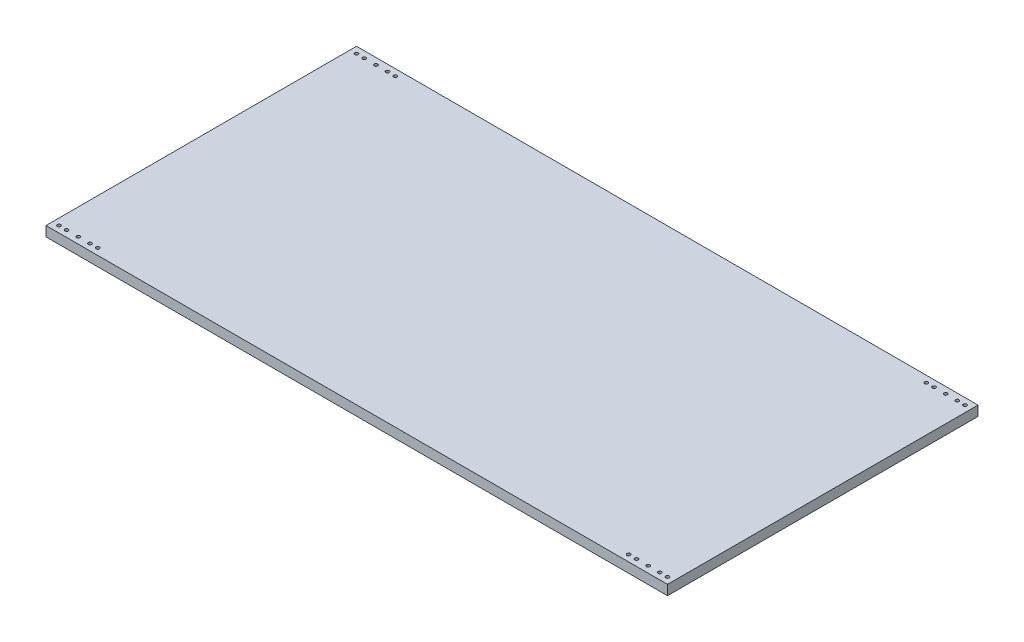
ISO-10303-21;
HEADER;
FILE_DESCRIPTION(('STEP AP214'),'2;1');
FILE_NAME('part.step','',(''),(''),'','','');
FILE_SCHEMA(('AUTOMOTIVE_DESIGN { 1 0 10303 214 1 1 1 1 }'));
ENDSEC;
DATA;
#1=APPLICATION_CONTEXT('core data for automotive mechanical design processes');
#2=APPLICATION_PROTOCOL_DEFINITION('international standard','automotive_design',2000,#1);
#3=PRODUCT_CONTEXT('',#1,'mechanical');
#4=PRODUCT('Part','Part','',(#3));
#5=PRODUCT_RELATED_PRODUCT_CATEGORY('part','',(#4));
#6=PRODUCT_DEFINITION_FORMATION('','',#4);
#7=PRODUCT_DEFINITION_CONTEXT('part definition',#1,'design');
#8=PRODUCT_DEFINITION('design','',#6,#7);
#9=PRODUCT_DEFINITION_SHAPE('','',#8);
#10=(LENGTH_UNIT() NAMED_UNIT(*) SI_UNIT(.MILLI.,.METRE.));
#11=(NAMED_UNIT(*) PLANE_ANGLE_UNIT() SI_UNIT($,.RADIAN.));
#12=(NAMED_UNIT(*) SI_UNIT($,.STERADIAN.) SOLID_ANGLE_UNIT());
#13=UNCERTAINTY_MEASURE_WITH_UNIT(LENGTH_MEASURE(1.E-05),#10,'distance_accuracy_value','');
#14=(GEOMETRIC_REPRESENTATION_CONTEXT(3) GLOBAL_UNCERTAINTY_ASSIGNED_CONTEXT((#13)) GLOBAL_UNIT_ASSIGNED_CONTEXT((#10,
#11,#12)) REPRESENTATION_CONTEXT('',''));
#15=CARTESIAN_POINT('',(0.,0.,0.));
#16=DIRECTION('',(0.,0.,1.));
#17=DIRECTION('',(1.,0.,0.));
#18=AXIS2_PLACEMENT_3D('',#15,#16,#17);
#19=CARTESIAN_POINT('',(0.,0.,0.));
#20=DIRECTION('',(0.,1.,0.));
#21=DIRECTION('',(0.,0.,1.));
#22=AXIS2_PLACEMENT_3D('',#19,#20,#21);
#23=PLANE('',#22);
#24=CARTESIAN_POINT('',(-528.,0.,287.5));
#25=DIRECTION('',(0.,-1.,0.));
#26=DIRECTION('',(0.,0.,-1.));
#27=AXIS2_PLACEMENT_3D('',#24,#25,#26);
#28=CIRCLE('',#27,3.29999999999997);
#29=CARTESIAN_POINT('',(-528.,0.,284.2));
#30=VERTEX_POINT('',#29);
#31=EDGE_CURVE('E221',#30,#30,#28,.T.);
#32=ORIENTED_EDGE('',*,*,#31,.F.);
#33=EDGE_LOOP('',(#32));
#34=FACE_BOUND('',#33,.T.);
#35=CARTESIAN_POINT('',(-513.,0.,287.5));
#36=DIRECTION('',(0.,-1.,0.));
#37=DIRECTION('',(0.,0.,-1.));
#38=AXIS2_PLACEMENT_3D('',#35,#36,#37);
#39=CIRCLE('',#38,3.29999999999997);
#40=CARTESIAN_POINT('',(-513.,0.,284.2));
#41=VERTEX_POINT('',#40);
#42=EDGE_CURVE('E215',#41,#41,#39,.T.);
#43=ORIENTED_EDGE('',*,*,#42,.F.);
#44=EDGE_LOOP('',(#43));
#45=FACE_BOUND('',#44,.T.);
#46=CARTESIAN_POINT('',(-588.,0.,-287.5));
#47=DIRECTION('',(0.,-1.,0.));
#48=DIRECTION('',(0.,0.,-1.));
#49=AXIS2_PLACEMENT_3D('',#46,#47,#48);
#50=CIRCLE('',#49,3.29999999999997);
#51=CARTESIAN_POINT('',(-588.,0.,-290.8));
#52=VERTEX_POINT('',#51);
#53=EDGE_CURVE('E209',#52,#52,#50,.T.);
#54=ORIENTED_EDGE('',*,*,#53,.F.);
#55=EDGE_LOOP('',(#54));
#56=FACE_BOUND('',#55,.T.);
#57=CARTESIAN_POINT('',(-550.5,0.,-287.5));
#58=DIRECTION('',(0.,-1.,0.));
#59=DIRECTION('',(0.,0.,-1.));
#60=AXIS2_PLACEMENT_3D('',#57,#58,#59);
#61=CIRCLE('',#60,3.29999999999997);
#62=CARTESIAN_POINT('',(-550.5,0.,-290.8));
#63=VERTEX_POINT('',#62);
#64=EDGE_CURVE('E197',#63,#63,#61,.T.);
#65=ORIENTED_EDGE('',*,*,#64,.F.);
#66=EDGE_LOOP('',(#65));
#67=FACE_BOUND('',#66,.T.);
#68=CARTESIAN_POINT('',(-513.,0.,-287.5));
#69=DIRECTION('',(0.,-1.,0.));
#70=DIRECTION('',(0.,0.,-1.));
#71=AXIS2_PLACEMENT_3D('',#68,#69,#70);
#72=CIRCLE('',#71,3.29999999999997);
#73=CARTESIAN_POINT('',(-513.,0.,-290.8));
#74=VERTEX_POINT('',#73);
#75=EDGE_CURVE('E185',#74,#74,#72,.T.);
#76=ORIENTED_EDGE('',*,*,#75,.F.);
#77=EDGE_LOOP('',(#76));
#78=FACE_BOUND('',#77,.T.);
#79=CARTESIAN_POINT('',(513.,0.,-287.5));
#80=DIRECTION('',(0.,-1.,0.));
#81=DIRECTION('',(0.,0.,-1.));
#82=AXIS2_PLACEMENT_3D('',#79,#80,#81);
#83=CIRCLE('',#82,3.29999999999997);
#84=CARTESIAN_POINT('',(513.,0.,-290.8));
#85=VERTEX_POINT('',#84);
#86=EDGE_CURVE('E179',#85,#85,#83,.T.);
#87=ORIENTED_EDGE('',*,*,#86,.F.);
#88=EDGE_LOOP('',(#87));
#89=FACE_BOUND('',#88,.T.);
#90=CARTESIAN_POINT('',(528.,0.,-287.5));
#91=DIRECTION('',(0.,-1.,0.));
#92=DIRECTION('',(0.,0.,-1.));
#93=AXIS2_PLACEMENT_3D('',#90,#91,#92);
#94=CIRCLE('',#93,3.29999999999997);
#95=CARTESIAN_POINT('',(528.,0.,-290.8));
#96=VERTEX_POINT('',#95);
#97=EDGE_CURVE('E173',#96,#96,#94,.T.);
#98=ORIENTED_EDGE('',*,*,#97,.F.);
#99=EDGE_LOOP('',(#98));
#100=FACE_BOUND('',#99,.T.);
#101=CARTESIAN_POINT('',(573.,0.,-287.5));
#102=DIRECTION('',(0.,-1.,0.));
#103=DIRECTION('',(0.,0.,-1.));
#104=AXIS2_PLACEMENT_3D('',#101,#102,#103);
#105=CIRCLE('',#104,3.29999999999997);
#106=CARTESIAN_POINT('',(573.,0.,-290.8));
#107=VERTEX_POINT('',#106);
#108=EDGE_CURVE('E161',#107,#107,#105,.T.);
#109=ORIENTED_EDGE('',*,*,#108,.F.);
#110=EDGE_LOOP('',(#109));
#111=FACE_BOUND('',#110,.T.);
#112=CARTESIAN_POINT('',(513.,0.,287.5));
#113=DIRECTION('',(0.,-1.,0.));
#114=DIRECTION('',(0.,0.,-1.));
#115=AXIS2_PLACEMENT_3D('',#112,#113,#114);
#116=CIRCLE('',#115,3.29999999999997);
#117=CARTESIAN_POINT('',(513.,0.,284.2));
#118=VERTEX_POINT('',#117);
#119=EDGE_CURVE('E149',#118,#118,#116,.T.);
#120=ORIENTED_EDGE('',*,*,#119,.F.);
#121=EDGE_LOOP('',(#120));
#122=FACE_BOUND('',#121,.T.);
#123=CARTESIAN_POINT('',(528.,0.,287.5));
#124=DIRECTION('',(0.,-1.,0.));
#125=DIRECTION('',(0.,0.,-1.));
#126=AXIS2_PLACEMENT_3D('',#123,#124,#125);
#127=CIRCLE('',#126,3.29999999999997);
#128=CARTESIAN_POINT('',(528.,0.,284.2));
#129=VERTEX_POINT('',#128);
#130=EDGE_CURVE('E143',#129,#129,#127,.T.);
#131=ORIENTED_EDGE('',*,*,#130,.F.);
#132=EDGE_LOOP('',(#131));
#133=FACE_BOUND('',#132,.T.);
#134=CARTESIAN_POINT('',(588.,0.,287.5));
#135=DIRECTION('',(0.,-1.,0.));
#136=DIRECTION('',(0.,0.,-1.));
#137=AXIS2_PLACEMENT_3D('',#134,#135,#136);
#138=CIRCLE('',#137,3.29999999999997);
#139=CARTESIAN_POINT('',(588.,0.,284.2));
#140=VERTEX_POINT('',#139);
#141=EDGE_CURVE('E125',#140,#140,#138,.T.);
#142=ORIENTED_EDGE('',*,*,#141,.F.);
#143=EDGE_LOOP('',(#142));
#144=FACE_BOUND('',#143,.T.);
#145=DIRECTION('',(0.,0.,-1.));
#146=VECTOR('',#145,1.);
#147=CARTESIAN_POINT('',(600.5,0.,-300.));
#148=LINE('',#147,#146);
#149=CARTESIAN_POINT('',(600.5,0.,300.));
#150=VERTEX_POINT('',#149);
#151=CARTESIAN_POINT('',(600.5,0.,-300.));
#152=VERTEX_POINT('',#151);
#153=EDGE_CURVE('E109',#150,#152,#148,.T.);
#154=ORIENTED_EDGE('',*,*,#153,.F.);
#155=DIRECTION('',(1.,0.,0.));
#156=VECTOR('',#155,1.);
#157=CARTESIAN_POINT('',(-600.5,0.,300.));
#158=LINE('',#157,#156);
#159=CARTESIAN_POINT('',(-600.5,0.,300.));
#160=VERTEX_POINT('',#159);
#161=EDGE_CURVE('E84',#160,#150,#158,.T.);
#162=ORIENTED_EDGE('',*,*,#161,.F.);
#163=DIRECTION('',(0.,0.,1.));
#164=VECTOR('',#163,1.);
#165=CARTESIAN_POINT('',(-600.5,0.,-300.));
#166=LINE('',#165,#164);
#167=CARTESIAN_POINT('',(-600.5,0.,-300.));
#168=VERTEX_POINT('',#167);
#169=EDGE_CURVE('E78',#168,#160,#166,.T.);
#170=ORIENTED_EDGE('',*,*,#169,.F.);
#171=DIRECTION('',(-1.,0.,0.));
#172=VECTOR('',#171,1.);
#173=CARTESIAN_POINT('',(-600.5,0.,-300.));
#174=LINE('',#173,#172);
#175=EDGE_CURVE('E101',#152,#168,#174,.T.);
#176=ORIENTED_EDGE('',*,*,#175,.F.);
#177=EDGE_LOOP('',(#154,#162,#170,#176));
#178=FACE_BOUND('',#177,.T.);
#179=CARTESIAN_POINT('',(573.,0.,287.5));
#180=DIRECTION('',(0.,-1.,0.));
#181=DIRECTION('',(0.,0.,-1.));
#182=AXIS2_PLACEMENT_3D('',#179,#180,#181);
#183=CIRCLE('',#182,3.29999999999997);
#184=CARTESIAN_POINT('',(573.,0.,284.2));
#185=VERTEX_POINT('',#184);
#186=EDGE_CURVE('E131',#185,#185,#183,.T.);
#187=ORIENTED_EDGE('',*,*,#186,.F.);
#188=EDGE_LOOP('',(#187));
#189=FACE_BOUND('',#188,.T.);
#190=CARTESIAN_POINT('',(550.5,0.,287.5));
#191=DIRECTION('',(0.,-1.,0.));
#192=DIRECTION('',(0.,0.,-1.));
#193=AXIS2_PLACEMENT_3D('',#190,#191,#192);
#194=CIRCLE('',#193,3.29999999999997);
#195=CARTESIAN_POINT('',(550.5,0.,284.2));
#196=VERTEX_POINT('',#195);
#197=EDGE_CURVE('E137',#196,#196,#194,.T.);
#198=ORIENTED_EDGE('',*,*,#197,.F.);
#199=EDGE_LOOP('',(#198));
#200=FACE_BOUND('',#199,.T.);
#201=CARTESIAN_POINT('',(588.,0.,-287.5));
#202=DIRECTION('',(0.,-1.,0.));
#203=DIRECTION('',(0.,0.,-1.));
#204=AXIS2_PLACEMENT_3D('',#201,#202,#203);
#205=CIRCLE('',#204,3.29999999999997);
#206=CARTESIAN_POINT('',(588.,0.,-290.8));
#207=VERTEX_POINT('',#206);
#208=EDGE_CURVE('E155',#207,#207,#205,.T.);
#209=ORIENTED_EDGE('',*,*,#208,.F.);
#210=EDGE_LOOP('',(#209));
#211=FACE_BOUND('',#210,.T.);
#212=CARTESIAN_POINT('',(550.5,0.,-287.5));
#213=DIRECTION('',(0.,-1.,0.));
#214=DIRECTION('',(0.,0.,-1.));
#215=AXIS2_PLACEMENT_3D('',#212,#213,#214);
#216=CIRCLE('',#215,3.29999999999997);
#217=CARTESIAN_POINT('',(550.5,0.,-290.8));
#218=VERTEX_POINT('',#217);
#219=EDGE_CURVE('E167',#218,#218,#216,.T.);
#220=ORIENTED_EDGE('',*,*,#219,.F.);
#221=EDGE_LOOP('',(#220));
#222=FACE_BOUND('',#221,.T.);
#223=CARTESIAN_POINT('',(-528.,0.,-287.5));
#224=DIRECTION('',(0.,-1.,0.));
#225=DIRECTION('',(0.,0.,-1.));
#226=AXIS2_PLACEMENT_3D('',#223,#224,#225);
#227=CIRCLE('',#226,3.29999999999997);
#228=CARTESIAN_POINT('',(-528.,0.,-290.8));
#229=VERTEX_POINT('',#228);
#230=EDGE_CURVE('E191',#229,#229,#227,.T.);
#231=ORIENTED_EDGE('',*,*,#230,.F.);
#232=EDGE_LOOP('',(#231));
#233=FACE_BOUND('',#232,.T.);
#234=CARTESIAN_POINT('',(-573.,0.,-287.5));
#235=DIRECTION('',(0.,-1.,0.));
#236=DIRECTION('',(0.,0.,-1.));
#237=AXIS2_PLACEMENT_3D('',#234,#235,#236);
#238=CIRCLE('',#237,3.29999999999997);
#239=CARTESIAN_POINT('',(-573.,0.,-290.8));
#240=VERTEX_POINT('',#239);
#241=EDGE_CURVE('E203',#240,#240,#238,.T.);
#242=ORIENTED_EDGE('',*,*,#241,.F.);
#243=EDGE_LOOP('',(#242));
#244=FACE_BOUND('',#243,.T.);
#245=CARTESIAN_POINT('',(-550.5,0.,287.5));
#246=DIRECTION('',(0.,-1.,0.));
#247=DIRECTION('',(0.,0.,-1.));
#248=AXIS2_PLACEMENT_3D('',#245,#246,#247);
#249=CIRCLE('',#248,3.29999999999997);
#250=CARTESIAN_POINT('',(-550.5,0.,284.2));
#251=VERTEX_POINT('',#250);
#252=EDGE_CURVE('E227',#251,#251,#249,.T.);
#253=ORIENTED_EDGE('',*,*,#252,.F.);
#254=EDGE_LOOP('',(#253));
#255=FACE_BOUND('',#254,.T.);
#256=CARTESIAN_POINT('',(-573.,0.,287.5));
#257=DIRECTION('',(0.,-1.,0.));
#258=DIRECTION('',(0.,0.,-1.));
#259=AXIS2_PLACEMENT_3D('',#256,#257,#258);
#260=CIRCLE('',#259,3.29999999999997);
#261=CARTESIAN_POINT('',(-573.,0.,284.2));
#262=VERTEX_POINT('',#261);
#263=EDGE_CURVE('E233',#262,#262,#260,.T.);
#264=ORIENTED_EDGE('',*,*,#263,.F.);
#265=EDGE_LOOP('',(#264));
#266=FACE_BOUND('',#265,.T.);
#267=CARTESIAN_POINT('',(-588.,0.,287.5));
#268=DIRECTION('',(0.,-1.,0.));
#269=DIRECTION('',(0.,0.,-1.));
#270=AXIS2_PLACEMENT_3D('',#267,#268,#269);
#271=CIRCLE('',#270,3.29999999999997);
#272=CARTESIAN_POINT('',(-588.,0.,284.2));
#273=VERTEX_POINT('',#272);
#274=EDGE_CURVE('E239',#273,#273,#271,.T.);
#275=ORIENTED_EDGE('',*,*,#274,.F.);
#276=EDGE_LOOP('',(#275));
#277=FACE_BOUND('',#276,.T.);
#278=ADVANCED_FACE('F44',(#34,#45,#56,#67,#78,#89,#100,#111,#122,#133,#144,#178,#189,#200,#211,
#222,#233,#244,#255,#266,#277),#23,.F.);
#279=CARTESIAN_POINT('',(0.,19.05,0.));
#280=DIRECTION('',(0.,1.,0.));
#281=DIRECTION('',(0.,0.,1.));
#282=AXIS2_PLACEMENT_3D('',#279,#280,#281);
#283=PLANE('',#282);
#284=CARTESIAN_POINT('',(-588.,19.05,287.5));
#285=DIRECTION('',(0.,-1.,0.));
#286=DIRECTION('',(0.,0.,-1.));
#287=AXIS2_PLACEMENT_3D('',#284,#285,#286);
#288=CIRCLE('',#287,3.29999999999997);
#289=CARTESIAN_POINT('',(-588.,19.05,284.2));
#290=VERTEX_POINT('',#289);
#291=EDGE_CURVE('E236',#290,#290,#288,.T.);
#292=ORIENTED_EDGE('',*,*,#291,.T.);
#293=EDGE_LOOP('',(#292));
#294=FACE_BOUND('',#293,.T.);
#295=CARTESIAN_POINT('',(-573.,19.05,287.5));
#296=DIRECTION('',(0.,-1.,0.));
#297=DIRECTION('',(0.,0.,-1.));
#298=AXIS2_PLACEMENT_3D('',#295,#296,#297);
#299=CIRCLE('',#298,3.29999999999997);
#300=CARTESIAN_POINT('',(-573.,19.05,284.2));
#301=VERTEX_POINT('',#300);
#302=EDGE_CURVE('E230',#301,#301,#299,.T.);
#303=ORIENTED_EDGE('',*,*,#302,.T.);
#304=EDGE_LOOP('',(#303));
#305=FACE_BOUND('',#304,.T.);
#306=CARTESIAN_POINT('',(-550.5,19.05,287.5));
#307=DIRECTION('',(0.,-1.,0.));
#308=DIRECTION('',(0.,0.,-1.));
#309=AXIS2_PLACEMENT_3D('',#306,#307,#308);
#310=CIRCLE('',#309,3.29999999999997);
#311=CARTESIAN_POINT('',(-550.5,19.05,284.2));
#312=VERTEX_POINT('',#311);
#313=EDGE_CURVE('E224',#312,#312,#310,.T.);
#314=ORIENTED_EDGE('',*,*,#313,.T.);
#315=EDGE_LOOP('',(#314));
#316=FACE_BOUND('',#315,.T.);
#317=CARTESIAN_POINT('',(-528.,19.05,287.5));
#318=DIRECTION('',(0.,-1.,0.));
#319=DIRECTION('',(0.,0.,-1.));
#320=AXIS2_PLACEMENT_3D('',#317,#318,#319);
#321=CIRCLE('',#320,3.29999999999997);
#322=CARTESIAN_POINT('',(-528.,19.05,284.2));
#323=VERTEX_POINT('',#322);
#324=EDGE_CURVE('E218',#323,#323,#321,.T.);
#325=ORIENTED_EDGE('',*,*,#324,.T.);
#326=EDGE_LOOP('',(#325));
#327=FACE_BOUND('',#326,.T.);
#328=CARTESIAN_POINT('',(-513.,19.05,287.5));
#329=DIRECTION('',(0.,-1.,0.));
#330=DIRECTION('',(0.,0.,-1.));
#331=AXIS2_PLACEMENT_3D('',#328,#329,#330);
#332=CIRCLE('',#331,3.29999999999997);
#333=CARTESIAN_POINT('',(-513.,19.05,284.2));
#334=VERTEX_POINT('',#333);
#335=EDGE_CURVE('E212',#334,#334,#332,.T.);
#336=ORIENTED_EDGE('',*,*,#335,.T.);
#337=EDGE_LOOP('',(#336));
#338=FACE_BOUND('',#337,.T.);
#339=CARTESIAN_POINT('',(-588.,19.05,-287.5));
#340=DIRECTION('',(0.,-1.,0.));
#341=DIRECTION('',(0.,0.,-1.));
#342=AXIS2_PLACEMENT_3D('',#339,#340,#341);
#343=CIRCLE('',#342,3.29999999999997);
#344=CARTESIAN_POINT('',(-588.,19.05,-290.8));
#345=VERTEX_POINT('',#344);
#346=EDGE_CURVE('E206',#345,#345,#343,.T.);
#347=ORIENTED_EDGE('',*,*,#346,.T.);
#348=EDGE_LOOP('',(#347));
#349=FACE_BOUND('',#348,.T.);
#350=CARTESIAN_POINT('',(-528.,19.05,-287.5));
#351=DIRECTION('',(0.,-1.,0.));
#352=DIRECTION('',(0.,0.,-1.));
#353=AXIS2_PLACEMENT_3D('',#350,#351,#352);
#354=CIRCLE('',#353,3.29999999999997);
#355=CARTESIAN_POINT('',(-528.,19.05,-290.8));
#356=VERTEX_POINT('',#355);
#357=EDGE_CURVE('E188',#356,#356,#354,.T.);
#358=ORIENTED_EDGE('',*,*,#357,.T.);
#359=EDGE_LOOP('',(#358));
#360=FACE_BOUND('',#359,.T.);
#361=CARTESIAN_POINT('',(-513.,19.05,-287.5));
#362=DIRECTION('',(0.,-1.,0.));
#363=DIRECTION('',(0.,0.,-1.));
#364=AXIS2_PLACEMENT_3D('',#361,#362,#363);
#365=CIRCLE('',#364,3.29999999999997);
#366=CARTESIAN_POINT('',(-513.,19.05,-290.8));
#367=VERTEX_POINT('',#366);
#368=EDGE_CURVE('E182',#367,#367,#365,.T.);
#369=ORIENTED_EDGE('',*,*,#368,.T.);
#370=EDGE_LOOP('',(#369));
#371=FACE_BOUND('',#370,.T.);
#372=CARTESIAN_POINT('',(513.,19.05,-287.5));
#373=DIRECTION('',(0.,-1.,0.));
#374=DIRECTION('',(0.,0.,-1.));
#375=AXIS2_PLACEMENT_3D('',#372,#373,#374);
#376=CIRCLE('',#375,3.29999999999997);
#377=CARTESIAN_POINT('',(513.,19.05,-290.8));
#378=VERTEX_POINT('',#377);
#379=EDGE_CURVE('E176',#378,#378,#376,.T.);
#380=ORIENTED_EDGE('',*,*,#379,.T.);
#381=EDGE_LOOP('',(#380));
#382=FACE_BOUND('',#381,.T.);
#383=CARTESIAN_POINT('',(528.,19.05,-287.5));
#384=DIRECTION('',(0.,-1.,0.));
#385=DIRECTION('',(0.,0.,-1.));
#386=AXIS2_PLACEMENT_3D('',#383,#384,#385);
#387=CIRCLE('',#386,3.29999999999997);
#388=CARTESIAN_POINT('',(528.,19.05,-290.8));
#389=VERTEX_POINT('',#388);
#390=EDGE_CURVE('E170',#389,#389,#387,.T.);
#391=ORIENTED_EDGE('',*,*,#390,.T.);
#392=EDGE_LOOP('',(#391));
#393=FACE_BOUND('',#392,.T.);
#394=CARTESIAN_POINT('',(588.,19.05,-287.5));
#395=DIRECTION('',(0.,-1.,0.));
#396=DIRECTION('',(0.,0.,-1.));
#397=AXIS2_PLACEMENT_3D('',#394,#395,#396);
#398=CIRCLE('',#397,3.29999999999997);
#399=CARTESIAN_POINT('',(588.,19.05,-290.8));
#400=VERTEX_POINT('',#399);
#401=EDGE_CURVE('E152',#400,#400,#398,.T.);
#402=ORIENTED_EDGE('',*,*,#401,.T.);
#403=EDGE_LOOP('',(#402));
#404=FACE_BOUND('',#403,.T.);
#405=CARTESIAN_POINT('',(513.,19.05,287.5));
#406=DIRECTION('',(0.,-1.,0.));
#407=DIRECTION('',(0.,0.,-1.));
#408=AXIS2_PLACEMENT_3D('',#405,#406,#407);
#409=CIRCLE('',#408,3.29999999999997);
#410=CARTESIAN_POINT('',(513.,19.05,284.2));
#411=VERTEX_POINT('',#410);
#412=EDGE_CURVE('E146',#411,#411,#409,.T.);
#413=ORIENTED_EDGE('',*,*,#412,.T.);
#414=EDGE_LOOP('',(#413));
#415=FACE_BOUND('',#414,.T.);
#416=CARTESIAN_POINT('',(528.,19.05,287.5));
#417=DIRECTION('',(0.,-1.,0.));
#418=DIRECTION('',(0.,0.,-1.));
#419=AXIS2_PLACEMENT_3D('',#416,#417,#418);
#420=CIRCLE('',#419,3.29999999999997);
#421=CARTESIAN_POINT('',(528.,19.05,284.2));
#422=VERTEX_POINT('',#421);
#423=EDGE_CURVE('E140',#422,#422,#420,.T.);
#424=ORIENTED_EDGE('',*,*,#423,.T.);
#425=EDGE_LOOP('',(#424));
#426=FACE_BOUND('',#425,.T.);
#427=CARTESIAN_POINT('',(550.5,19.05,287.5));
#428=DIRECTION('',(0.,-1.,0.));
#429=DIRECTION('',(0.,0.,-1.));
#430=AXIS2_PLACEMENT_3D('',#427,#428,#429);
#431=CIRCLE('',#430,3.29999999999997);
#432=CARTESIAN_POINT('',(550.5,19.05,284.2));
#433=VERTEX_POINT('',#432);
#434=EDGE_CURVE('E134',#433,#433,#431,.T.);
#435=ORIENTED_EDGE('',*,*,#434,.T.);
#436=EDGE_LOOP('',(#435));
#437=FACE_BOUND('',#436,.T.);
#438=DIRECTION('',(0.,0.,-1.));
#439=VECTOR('',#438,1.);
#440=CARTESIAN_POINT('',(600.5,19.05,-300.));
#441=LINE('',#440,#439);
#442=CARTESIAN_POINT('',(600.5,19.05,300.));
#443=VERTEX_POINT('',#442);
#444=CARTESIAN_POINT('',(600.5,19.05,-300.));
#445=VERTEX_POINT('',#444);
#446=EDGE_CURVE('E97',#443,#445,#441,.T.);
#447=ORIENTED_EDGE('',*,*,#446,.T.);
#448=DIRECTION('',(-1.,0.,0.));
#449=VECTOR('',#448,1.);
#450=CARTESIAN_POINT('',(-600.5,19.05,-300.));
#451=LINE('',#450,#449);
#452=CARTESIAN_POINT('',(-600.5,19.05,-300.));
#453=VERTEX_POINT('',#452);
#454=EDGE_CURVE('E91',#445,#453,#451,.T.);
#455=ORIENTED_EDGE('',*,*,#454,.T.);
#456=DIRECTION('',(0.,0.,1.));
#457=VECTOR('',#456,1.);
#458=CARTESIAN_POINT('',(-600.5,19.05,-300.));
#459=LINE('',#458,#457);
#460=CARTESIAN_POINT('',(-600.5,19.05,300.));
#461=VERTEX_POINT('',#460);
#462=EDGE_CURVE('E95',#453,#461,#459,.T.);
#463=ORIENTED_EDGE('',*,*,#462,.T.);
#464=DIRECTION('',(1.,0.,0.));
#465=VECTOR('',#464,1.);
#466=CARTESIAN_POINT('',(-600.5,19.05,300.));
#467=LINE('',#466,#465);
#468=EDGE_CURVE('E61',#461,#443,#467,.T.);
#469=ORIENTED_EDGE('',*,*,#468,.T.);
#470=EDGE_LOOP('',(#447,#455,#463,#469));
#471=FACE_BOUND('',#470,.T.);
#472=CARTESIAN_POINT('',(588.,19.05,287.5));
#473=DIRECTION('',(0.,-1.,0.));
#474=DIRECTION('',(0.,0.,-1.));
#475=AXIS2_PLACEMENT_3D('',#472,#473,#474);
#476=CIRCLE('',#475,3.29999999999997);
#477=CARTESIAN_POINT('',(588.,19.05,284.2));
#478=VERTEX_POINT('',#477);
#479=EDGE_CURVE('E112',#478,#478,#476,.T.);
#480=ORIENTED_EDGE('',*,*,#479,.T.);
#481=EDGE_LOOP('',(#480));
#482=FACE_BOUND('',#481,.T.);
#483=CARTESIAN_POINT('',(573.,19.05,287.5));
#484=DIRECTION('',(0.,-1.,0.));
#485=DIRECTION('',(0.,0.,-1.));
#486=AXIS2_PLACEMENT_3D('',#483,#484,#485);
#487=CIRCLE('',#486,3.29999999999997);
#488=CARTESIAN_POINT('',(573.,19.05,284.2));
#489=VERTEX_POINT('',#488);
#490=EDGE_CURVE('E128',#489,#489,#487,.T.);
#491=ORIENTED_EDGE('',*,*,#490,.T.);
#492=EDGE_LOOP('',(#491));
#493=FACE_BOUND('',#492,.T.);
#494=CARTESIAN_POINT('',(573.,19.05,-287.5));
#495=DIRECTION('',(0.,-1.,0.));
#496=DIRECTION('',(0.,0.,-1.));
#497=AXIS2_PLACEMENT_3D('',#494,#495,#496);
#498=CIRCLE('',#497,3.29999999999997);
#499=CARTESIAN_POINT('',(573.,19.05,-290.8));
#500=VERTEX_POINT('',#499);
#501=EDGE_CURVE('E158',#500,#500,#498,.T.);
#502=ORIENTED_EDGE('',*,*,#501,.T.);
#503=EDGE_LOOP('',(#502));
#504=FACE_BOUND('',#503,.T.);
#505=CARTESIAN_POINT('',(550.5,19.05,-287.5));
#506=DIRECTION('',(0.,-1.,0.));
#507=DIRECTION('',(0.,0.,-1.));
#508=AXIS2_PLACEMENT_3D('',#505,#506,#507);
#509=CIRCLE('',#508,3.29999999999997);
#510=CARTESIAN_POINT('',(550.5,19.05,-290.8));
#511=VERTEX_POINT('',#510);
#512=EDGE_CURVE('E164',#511,#511,#509,.T.);
#513=ORIENTED_EDGE('',*,*,#512,.T.);
#514=EDGE_LOOP('',(#513));
#515=FACE_BOUND('',#514,.T.);
#516=CARTESIAN_POINT('',(-550.5,19.05,-287.5));
#517=DIRECTION('',(0.,-1.,0.));
#518=DIRECTION('',(0.,0.,-1.));
#519=AXIS2_PLACEMENT_3D('',#516,#517,#518);
#520=CIRCLE('',#519,3.29999999999997);
#521=CARTESIAN_POINT('',(-550.5,19.05,-290.8));
#522=VERTEX_POINT('',#521);
#523=EDGE_CURVE('E194',#522,#522,#520,.T.);
#524=ORIENTED_EDGE('',*,*,#523,.T.);
#525=EDGE_LOOP('',(#524));
#526=FACE_BOUND('',#525,.T.);
#527=CARTESIAN_POINT('',(-573.,19.05,-287.5));
#528=DIRECTION('',(0.,-1.,0.));
#529=DIRECTION('',(0.,0.,-1.));
#530=AXIS2_PLACEMENT_3D('',#527,#528,#529);
#531=CIRCLE('',#530,3.29999999999997);
#532=CARTESIAN_POINT('',(-573.,19.05,-290.8));
#533=VERTEX_POINT('',#532);
#534=EDGE_CURVE('E200',#533,#533,#531,.T.);
#535=ORIENTED_EDGE('',*,*,#534,.T.);
#536=EDGE_LOOP('',(#535));
#537=FACE_BOUND('',#536,.T.);
#538=ADVANCED_FACE('F92',(#294,#305,#316,#327,#338,#349,#360,#371,#382,#393,#404,#415,#426,#437,
#471,#482,#493,#504,#515,#526,#537),#283,.T.);
#539=CARTESIAN_POINT('',(600.5,19.05,-300.));
#540=DIRECTION('',(-1.,0.,0.));
#541=DIRECTION('',(0.,0.,1.));
#542=AXIS2_PLACEMENT_3D('',#539,#540,#541);
#543=PLANE('',#542);
#544=ORIENTED_EDGE('',*,*,#153,.T.);
#545=DIRECTION('',(0.,-1.,0.));
#546=VECTOR('',#545,1.);
#547=CARTESIAN_POINT('',(600.5,19.05,-300.));
#548=LINE('',#547,#546);
#549=EDGE_CURVE('E11',#445,#152,#548,.T.);
#550=ORIENTED_EDGE('',*,*,#549,.F.);
#551=ORIENTED_EDGE('',*,*,#446,.F.);
#552=DIRECTION('',(0.,-1.,0.));
#553=VECTOR('',#552,1.);
#554=CARTESIAN_POINT('',(600.5,19.05,300.));
#555=LINE('',#554,#553);
#556=EDGE_CURVE('E105',#443,#150,#555,.T.);
#557=ORIENTED_EDGE('',*,*,#556,.T.);
#558=EDGE_LOOP('',(#544,#550,#551,#557));
#559=FACE_BOUND('',#558,.T.);
#560=ADVANCED_FACE('F46',(#559),#543,.F.);
#561=CARTESIAN_POINT('',(-600.5,19.05,-300.));
#562=DIRECTION('',(0.,0.,1.));
#563=DIRECTION('',(1.,0.,0.));
#564=AXIS2_PLACEMENT_3D('',#561,#562,#563);
#565=PLANE('',#564);
#566=ORIENTED_EDGE('',*,*,#175,.T.);
#567=DIRECTION('',(0.,-1.,0.));
#568=VECTOR('',#567,1.);
#569=CARTESIAN_POINT('',(-600.5,19.05,-300.));
#570=LINE('',#569,#568);
#571=EDGE_CURVE('E53',#453,#168,#570,.T.);
#572=ORIENTED_EDGE('',*,*,#571,.F.);
#573=ORIENTED_EDGE('',*,*,#454,.F.);
#574=ORIENTED_EDGE('',*,*,#549,.T.);
#575=EDGE_LOOP('',(#566,#572,#573,#574));
#576=FACE_BOUND('',#575,.T.);
#577=ADVANCED_FACE('F100',(#576),#565,.F.);
#578=CARTESIAN_POINT('',(-600.5,19.05,-300.));
#579=DIRECTION('',(1.,0.,0.));
#580=DIRECTION('',(0.,0.,-1.));
#581=AXIS2_PLACEMENT_3D('',#578,#579,#580);
#582=PLANE('',#581);
#583=ORIENTED_EDGE('',*,*,#169,.T.);
#584=DIRECTION('',(0.,-1.,0.));
#585=VECTOR('',#584,1.);
#586=CARTESIAN_POINT('',(-600.5,19.05,300.));
#587=LINE('',#586,#585);
#588=EDGE_CURVE('E102',#461,#160,#587,.T.);
#589=ORIENTED_EDGE('',*,*,#588,.F.);
#590=ORIENTED_EDGE('',*,*,#462,.F.);
#591=ORIENTED_EDGE('',*,*,#571,.T.);
#592=EDGE_LOOP('',(#583,#589,#590,#591));
#593=FACE_BOUND('',#592,.T.);
#594=ADVANCED_FACE('F103',(#593),#582,.F.);
#595=CARTESIAN_POINT('',(-600.5,19.05,300.));
#596=DIRECTION('',(0.,0.,-1.));
#597=DIRECTION('',(-1.,0.,0.));
#598=AXIS2_PLACEMENT_3D('',#595,#596,#597);
#599=PLANE('',#598);
#600=ORIENTED_EDGE('',*,*,#161,.T.);
#601=ORIENTED_EDGE('',*,*,#556,.F.);
#602=ORIENTED_EDGE('',*,*,#468,.F.);
#603=ORIENTED_EDGE('',*,*,#588,.T.);
#604=EDGE_LOOP('',(#600,#601,#602,#603));
#605=FACE_BOUND('',#604,.T.);
#606=ADVANCED_FACE('F117',(#605),#599,.F.);
#607=CARTESIAN_POINT('',(588.,0.,287.5));
#608=DIRECTION('',(0.,-1.,0.));
#609=DIRECTION('',(0.,0.,-1.));
#610=AXIS2_PLACEMENT_3D('',#607,#608,#609);
#611=CYLINDRICAL_SURFACE('',#610,3.29999999999997);
#612=ORIENTED_EDGE('',*,*,#479,.F.);
#613=EDGE_LOOP('',(#612));
#614=FACE_BOUND('',#613,.T.);
#615=ORIENTED_EDGE('',*,*,#141,.T.);
#616=EDGE_LOOP('',(#615));
#617=FACE_BOUND('',#616,.T.);
#618=ADVANCED_FACE('F259',(#614,#617),#611,.F.);
#619=CARTESIAN_POINT('',(573.,0.,287.5));
#620=DIRECTION('',(0.,-1.,0.));
#621=DIRECTION('',(0.,0.,-1.));
#622=AXIS2_PLACEMENT_3D('',#619,#620,#621);
#623=CYLINDRICAL_SURFACE('',#622,3.29999999999997);
#624=ORIENTED_EDGE('',*,*,#490,.F.);
#625=EDGE_LOOP('',(#624));
#626=FACE_BOUND('',#625,.T.);
#627=ORIENTED_EDGE('',*,*,#186,.T.);
#628=EDGE_LOOP('',(#627));
#629=FACE_BOUND('',#628,.T.);
#630=ADVANCED_FACE('F310',(#626,#629),#623,.F.);
#631=CARTESIAN_POINT('',(550.5,0.,287.5));
#632=DIRECTION('',(0.,-1.,0.));
#633=DIRECTION('',(0.,0.,-1.));
#634=AXIS2_PLACEMENT_3D('',#631,#632,#633);
#635=CYLINDRICAL_SURFACE('',#634,3.29999999999997);
#636=ORIENTED_EDGE('',*,*,#434,.F.);
#637=EDGE_LOOP('',(#636));
#638=FACE_BOUND('',#637,.T.);
#639=ORIENTED_EDGE('',*,*,#197,.T.);
#640=EDGE_LOOP('',(#639));
#641=FACE_BOUND('',#640,.T.);
#642=ADVANCED_FACE('F319',(#638,#641),#635,.F.);
#643=CARTESIAN_POINT('',(528.,0.,287.5));
#644=DIRECTION('',(0.,-1.,0.));
#645=DIRECTION('',(0.,0.,-1.));
#646=AXIS2_PLACEMENT_3D('',#643,#644,#645);
#647=CYLINDRICAL_SURFACE('',#646,3.29999999999997);
#648=ORIENTED_EDGE('',*,*,#423,.F.);
#649=EDGE_LOOP('',(#648));
#650=FACE_BOUND('',#649,.T.);
#651=ORIENTED_EDGE('',*,*,#130,.T.);
#652=EDGE_LOOP('',(#651));
#653=FACE_BOUND('',#652,.T.);
#654=ADVANCED_FACE('F329',(#650,#653),#647,.F.);
#655=CARTESIAN_POINT('',(513.,0.,287.5));
#656=DIRECTION('',(0.,-1.,0.));
#657=DIRECTION('',(0.,0.,-1.));
#658=AXIS2_PLACEMENT_3D('',#655,#656,#657);
#659=CYLINDRICAL_SURFACE('',#658,3.29999999999997);
#660=ORIENTED_EDGE('',*,*,#412,.F.);
#661=EDGE_LOOP('',(#660));
#662=FACE_BOUND('',#661,.T.);
#663=ORIENTED_EDGE('',*,*,#119,.T.);
#664=EDGE_LOOP('',(#663));
#665=FACE_BOUND('',#664,.T.);
#666=ADVANCED_FACE('F339',(#662,#665),#659,.F.);
#667=CARTESIAN_POINT('',(588.,0.,-287.5));
#668=DIRECTION('',(0.,-1.,0.));
#669=DIRECTION('',(0.,0.,-1.));
#670=AXIS2_PLACEMENT_3D('',#667,#668,#669);
#671=CYLINDRICAL_SURFACE('',#670,3.29999999999997);
#672=ORIENTED_EDGE('',*,*,#401,.F.);
#673=EDGE_LOOP('',(#672));
#674=FACE_BOUND('',#673,.T.);
#675=ORIENTED_EDGE('',*,*,#208,.T.);
#676=EDGE_LOOP('',(#675));
#677=FACE_BOUND('',#676,.T.);
#678=ADVANCED_FACE('F349',(#674,#677),#671,.F.);
#679=CARTESIAN_POINT('',(573.,0.,-287.5));
#680=DIRECTION('',(0.,-1.,0.));
#681=DIRECTION('',(0.,0.,-1.));
#682=AXIS2_PLACEMENT_3D('',#679,#680,#681);
#683=CYLINDRICAL_SURFACE('',#682,3.29999999999997);
#684=ORIENTED_EDGE('',*,*,#501,.F.);
#685=EDGE_LOOP('',(#684));
#686=FACE_BOUND('',#685,.T.);
#687=ORIENTED_EDGE('',*,*,#108,.T.);
#688=EDGE_LOOP('',(#687));
#689=FACE_BOUND('',#688,.T.);
#690=ADVANCED_FACE('F359',(#686,#689),#683,.F.);
#691=CARTESIAN_POINT('',(550.5,0.,-287.5));
#692=DIRECTION('',(0.,-1.,0.));
#693=DIRECTION('',(0.,0.,-1.));
#694=AXIS2_PLACEMENT_3D('',#691,#692,#693);
#695=CYLINDRICAL_SURFACE('',#694,3.29999999999997);
#696=ORIENTED_EDGE('',*,*,#512,.F.);
#697=EDGE_LOOP('',(#696));
#698=FACE_BOUND('',#697,.T.);
#699=ORIENTED_EDGE('',*,*,#219,.T.);
#700=EDGE_LOOP('',(#699));
#701=FACE_BOUND('',#700,.T.);
#702=ADVANCED_FACE('F369',(#698,#701),#695,.F.);
#703=CARTESIAN_POINT('',(528.,0.,-287.5));
#704=DIRECTION('',(0.,-1.,0.));
#705=DIRECTION('',(0.,0.,-1.));
#706=AXIS2_PLACEMENT_3D('',#703,#704,#705);
#707=CYLINDRICAL_SURFACE('',#706,3.29999999999997);
#708=ORIENTED_EDGE('',*,*,#390,.F.);
#709=EDGE_LOOP('',(#708));
#710=FACE_BOUND('',#709,.T.);
#711=ORIENTED_EDGE('',*,*,#97,.T.);
#712=EDGE_LOOP('',(#711));
#713=FACE_BOUND('',#712,.T.);
#714=ADVANCED_FACE('F379',(#710,#713),#707,.F.);
#715=CARTESIAN_POINT('',(513.,0.,-287.5));
#716=DIRECTION('',(0.,-1.,0.));
#717=DIRECTION('',(0.,0.,-1.));
#718=AXIS2_PLACEMENT_3D('',#715,#716,#717);
#719=CYLINDRICAL_SURFACE('',#718,3.29999999999997);
#720=ORIENTED_EDGE('',*,*,#379,.F.);
#721=EDGE_LOOP('',(#720));
#722=FACE_BOUND('',#721,.T.);
#723=ORIENTED_EDGE('',*,*,#86,.T.);
#724=EDGE_LOOP('',(#723));
#725=FACE_BOUND('',#724,.T.);
#726=ADVANCED_FACE('F389',(#722,#725),#719,.F.);
#727=CARTESIAN_POINT('',(-513.,0.,-287.5));
#728=DIRECTION('',(0.,-1.,0.));
#729=DIRECTION('',(0.,0.,-1.));
#730=AXIS2_PLACEMENT_3D('',#727,#728,#729);
#731=CYLINDRICAL_SURFACE('',#730,3.29999999999997);
#732=ORIENTED_EDGE('',*,*,#368,.F.);
#733=EDGE_LOOP('',(#732));
#734=FACE_BOUND('',#733,.T.);
#735=ORIENTED_EDGE('',*,*,#75,.T.);
#736=EDGE_LOOP('',(#735));
#737=FACE_BOUND('',#736,.T.);
#738=ADVANCED_FACE('F399',(#734,#737),#731,.F.);
#739=CARTESIAN_POINT('',(-528.,0.,-287.5));
#740=DIRECTION('',(0.,-1.,0.));
#741=DIRECTION('',(0.,0.,-1.));
#742=AXIS2_PLACEMENT_3D('',#739,#740,#741);
#743=CYLINDRICAL_SURFACE('',#742,3.29999999999997);
#744=ORIENTED_EDGE('',*,*,#357,.F.);
#745=EDGE_LOOP('',(#744));
#746=FACE_BOUND('',#745,.T.);
#747=ORIENTED_EDGE('',*,*,#230,.T.);
#748=EDGE_LOOP('',(#747));
#749=FACE_BOUND('',#748,.T.);
#750=ADVANCED_FACE('F409',(#746,#749),#743,.F.);
#751=CARTESIAN_POINT('',(-550.5,0.,-287.5));
#752=DIRECTION('',(0.,-1.,0.));
#753=DIRECTION('',(0.,0.,-1.));
#754=AXIS2_PLACEMENT_3D('',#751,#752,#753);
#755=CYLINDRICAL_SURFACE('',#754,3.29999999999997);
#756=ORIENTED_EDGE('',*,*,#523,.F.);
#757=EDGE_LOOP('',(#756));
#758=FACE_BOUND('',#757,.T.);
#759=ORIENTED_EDGE('',*,*,#64,.T.);
#760=EDGE_LOOP('',(#759));
#761=FACE_BOUND('',#760,.T.);
#762=ADVANCED_FACE('F419',(#758,#761),#755,.F.);
#763=CARTESIAN_POINT('',(-573.,0.,-287.5));
#764=DIRECTION('',(0.,-1.,0.));
#765=DIRECTION('',(0.,0.,-1.));
#766=AXIS2_PLACEMENT_3D('',#763,#764,#765);
#767=CYLINDRICAL_SURFACE('',#766,3.29999999999997);
#768=ORIENTED_EDGE('',*,*,#534,.F.);
#769=EDGE_LOOP('',(#768));
#770=FACE_BOUND('',#769,.T.);
#771=ORIENTED_EDGE('',*,*,#241,.T.);
#772=EDGE_LOOP('',(#771));
#773=FACE_BOUND('',#772,.T.);
#774=ADVANCED_FACE('F429',(#770,#773),#767,.F.);
#775=CARTESIAN_POINT('',(-588.,0.,-287.5));
#776=DIRECTION('',(0.,-1.,0.));
#777=DIRECTION('',(0.,0.,-1.));
#778=AXIS2_PLACEMENT_3D('',#775,#776,#777);
#779=CYLINDRICAL_SURFACE('',#778,3.29999999999997);
#780=ORIENTED_EDGE('',*,*,#346,.F.);
#781=EDGE_LOOP('',(#780));
#782=FACE_BOUND('',#781,.T.);
#783=ORIENTED_EDGE('',*,*,#53,.T.);
#784=EDGE_LOOP('',(#783));
#785=FACE_BOUND('',#784,.T.);
#786=ADVANCED_FACE('F439',(#782,#785),#779,.F.);
#787=CARTESIAN_POINT('',(-513.,0.,287.5));
#788=DIRECTION('',(0.,-1.,0.));
#789=DIRECTION('',(0.,0.,-1.));
#790=AXIS2_PLACEMENT_3D('',#787,#788,#789);
#791=CYLINDRICAL_SURFACE('',#790,3.29999999999997);
#792=ORIENTED_EDGE('',*,*,#335,.F.);
#793=EDGE_LOOP('',(#792));
#794=FACE_BOUND('',#793,.T.);
#795=ORIENTED_EDGE('',*,*,#42,.T.);
#796=EDGE_LOOP('',(#795));
#797=FACE_BOUND('',#796,.T.);
#798=ADVANCED_FACE('F449',(#794,#797),#791,.F.);
#799=CARTESIAN_POINT('',(-528.,0.,287.5));
#800=DIRECTION('',(0.,-1.,0.));
#801=DIRECTION('',(0.,0.,-1.));
#802=AXIS2_PLACEMENT_3D('',#799,#800,#801);
#803=CYLINDRICAL_SURFACE('',#802,3.29999999999997);
#804=ORIENTED_EDGE('',*,*,#324,.F.);
#805=EDGE_LOOP('',(#804));
#806=FACE_BOUND('',#805,.T.);
#807=ORIENTED_EDGE('',*,*,#31,.T.);
#808=EDGE_LOOP('',(#807));
#809=FACE_BOUND('',#808,.T.);
#810=ADVANCED_FACE('F459',(#806,#809),#803,.F.);
#811=CARTESIAN_POINT('',(-550.5,0.,287.5));
#812=DIRECTION('',(0.,-1.,0.));
#813=DIRECTION('',(0.,0.,-1.));
#814=AXIS2_PLACEMENT_3D('',#811,#812,#813);
#815=CYLINDRICAL_SURFACE('',#814,3.29999999999997);
#816=ORIENTED_EDGE('',*,*,#313,.F.);
#817=EDGE_LOOP('',(#816));
#818=FACE_BOUND('',#817,.T.);
#819=ORIENTED_EDGE('',*,*,#252,.T.);
#820=EDGE_LOOP('',(#819));
#821=FACE_BOUND('',#820,.T.);
#822=ADVANCED_FACE('F469',(#818,#821),#815,.F.);
#823=CARTESIAN_POINT('',(-573.,0.,287.5));
#824=DIRECTION('',(0.,-1.,0.));
#825=DIRECTION('',(0.,0.,-1.));
#826=AXIS2_PLACEMENT_3D('',#823,#824,#825);
#827=CYLINDRICAL_SURFACE('',#826,3.29999999999997);
#828=ORIENTED_EDGE('',*,*,#302,.F.);
#829=EDGE_LOOP('',(#828));
#830=FACE_BOUND('',#829,.T.);
#831=ORIENTED_EDGE('',*,*,#263,.T.);
#832=EDGE_LOOP('',(#831));
#833=FACE_BOUND('',#832,.T.);
#834=ADVANCED_FACE('F479',(#830,#833),#827,.F.);
#835=CARTESIAN_POINT('',(-588.,0.,287.5));
#836=DIRECTION('',(0.,-1.,0.));
#837=DIRECTION('',(0.,0.,-1.));
#838=AXIS2_PLACEMENT_3D('',#835,#836,#837);
#839=CYLINDRICAL_SURFACE('',#838,3.29999999999997);
#840=ORIENTED_EDGE('',*,*,#291,.F.);
#841=EDGE_LOOP('',(#840));
#842=FACE_BOUND('',#841,.T.);
#843=ORIENTED_EDGE('',*,*,#274,.T.);
#844=EDGE_LOOP('',(#843));
#845=FACE_BOUND('',#844,.T.);
#846=ADVANCED_FACE('F243',(#842,#845),#839,.F.);
#847=CLOSED_SHELL('',(#278,#538,#560,#577,#594,#606,#618,#630,#642,#654,#666,#678,#690,#702,
#714,#726,#738,#750,#762,#774,#786,#798,#810,#822,#834,#846));
#848=MANIFOLD_SOLID_BREP('B2',#847);
#849=ADVANCED_BREP_SHAPE_REPRESENTATION('',(#18,#848),#14);
#850=SHAPE_DEFINITION_REPRESENTATION(#9,#849);
ENDSEC;
END-ISO-10303-21;
